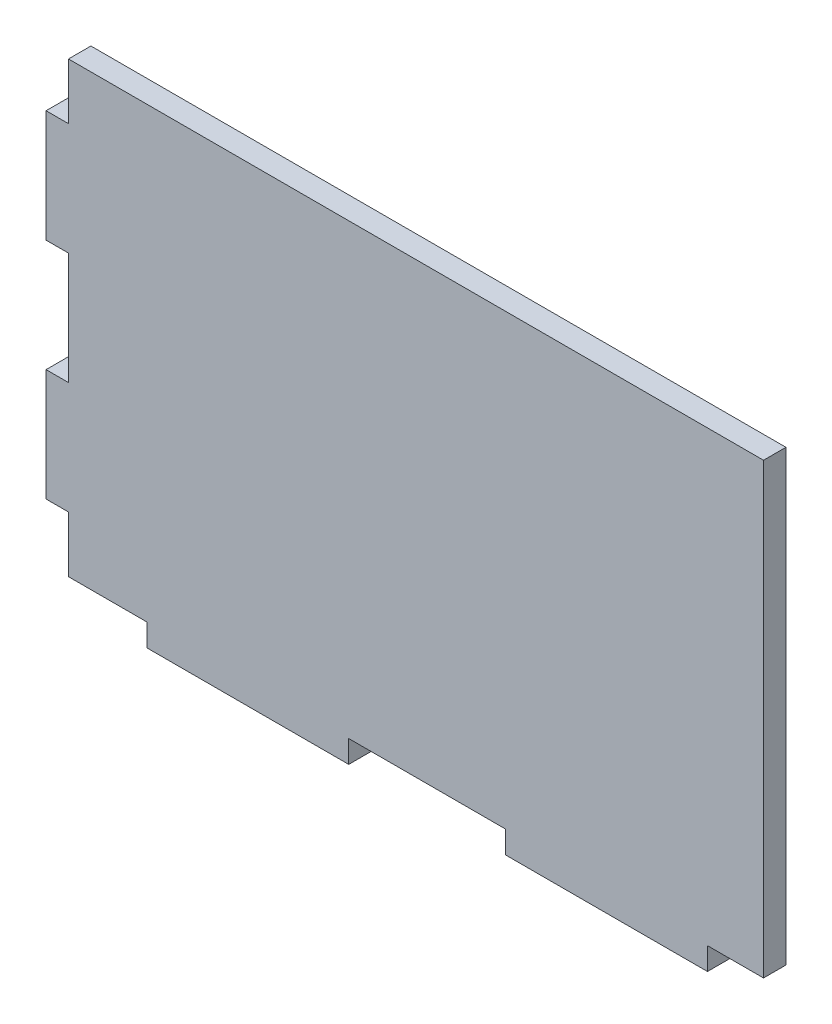
ISO-10303-21;
HEADER;
FILE_DESCRIPTION(('STEP AP214'),'2;1');
FILE_NAME('part.step','',(''),(''),'','','');
FILE_SCHEMA(('AUTOMOTIVE_DESIGN { 1 0 10303 214 1 1 1 1 }'));
ENDSEC;
DATA;
#1=APPLICATION_CONTEXT('core data for automotive mechanical design processes');
#2=APPLICATION_PROTOCOL_DEFINITION('international standard','automotive_design',2000,#1);
#3=PRODUCT_CONTEXT('',#1,'mechanical');
#4=PRODUCT('Part','Part','',(#3));
#5=PRODUCT_RELATED_PRODUCT_CATEGORY('part','',(#4));
#6=PRODUCT_DEFINITION_FORMATION('','',#4);
#7=PRODUCT_DEFINITION_CONTEXT('part definition',#1,'design');
#8=PRODUCT_DEFINITION('design','',#6,#7);
#9=PRODUCT_DEFINITION_SHAPE('','',#8);
#10=(LENGTH_UNIT() NAMED_UNIT(*) SI_UNIT(.MILLI.,.METRE.));
#11=(NAMED_UNIT(*) PLANE_ANGLE_UNIT() SI_UNIT($,.RADIAN.));
#12=(NAMED_UNIT(*) SI_UNIT($,.STERADIAN.) SOLID_ANGLE_UNIT());
#13=UNCERTAINTY_MEASURE_WITH_UNIT(LENGTH_MEASURE(1.E-05),#10,'distance_accuracy_value','');
#14=(GEOMETRIC_REPRESENTATION_CONTEXT(3) GLOBAL_UNCERTAINTY_ASSIGNED_CONTEXT((#13)) GLOBAL_UNIT_ASSIGNED_CONTEXT((#10,
#11,#12)) REPRESENTATION_CONTEXT('',''));
#15=CARTESIAN_POINT('',(0.,0.,0.));
#16=DIRECTION('',(0.,0.,1.));
#17=DIRECTION('',(1.,0.,0.));
#18=AXIS2_PLACEMENT_3D('',#15,#16,#17);
#19=CARTESIAN_POINT('',(0.,0.,5.));
#20=DIRECTION('',(-1.,0.,0.));
#21=DIRECTION('',(0.,0.,1.));
#22=AXIS2_PLACEMENT_3D('',#19,#20,#21);
#23=PLANE('',#22);
#24=DIRECTION('',(0.,1.,0.));
#25=VECTOR('',#24,1.);
#26=CARTESIAN_POINT('',(0.,0.,5.));
#27=LINE('',#26,#25);
#28=CARTESIAN_POINT('',(0.,37.5,5.));
#29=VERTEX_POINT('',#28);
#30=CARTESIAN_POINT('',(0.,62.5,5.));
#31=VERTEX_POINT('',#30);
#32=EDGE_CURVE('E241',#29,#31,#27,.T.);
#33=ORIENTED_EDGE('',*,*,#32,.T.);
#34=DIRECTION('',(0.,0.,1.));
#35=VECTOR('',#34,1.);
#36=CARTESIAN_POINT('',(0.,62.5,0.));
#37=LINE('',#36,#35);
#38=CARTESIAN_POINT('',(0.,62.5,0.));
#39=VERTEX_POINT('',#38);
#40=EDGE_CURVE('E205',#39,#31,#37,.T.);
#41=ORIENTED_EDGE('',*,*,#40,.F.);
#42=DIRECTION('',(0.,1.,0.));
#43=VECTOR('',#42,1.);
#44=CARTESIAN_POINT('',(0.,0.,0.));
#45=LINE('',#44,#43);
#46=CARTESIAN_POINT('',(0.,37.5,0.));
#47=VERTEX_POINT('',#46);
#48=EDGE_CURVE('E271',#47,#39,#45,.T.);
#49=ORIENTED_EDGE('',*,*,#48,.F.);
#50=DIRECTION('',(0.,0.,1.));
#51=VECTOR('',#50,1.);
#52=CARTESIAN_POINT('',(0.,37.5,0.));
#53=LINE('',#52,#51);
#54=EDGE_CURVE('E229',#47,#29,#53,.T.);
#55=ORIENTED_EDGE('',*,*,#54,.T.);
#56=EDGE_LOOP('',(#33,#41,#49,#55));
#57=FACE_BOUND('',#56,.T.);
#58=ADVANCED_FACE('F37',(#57),#23,.T.);
#59=DIRECTION('',(0.,0.,1.));
#60=VECTOR('',#59,1.);
#61=CARTESIAN_POINT('',(0.,87.5,0.));
#62=LINE('',#61,#60);
#63=CARTESIAN_POINT('',(0.,87.5,0.));
#64=VERTEX_POINT('',#63);
#65=CARTESIAN_POINT('',(0.,87.5,5.));
#66=VERTEX_POINT('',#65);
#67=EDGE_CURVE('E192',#64,#66,#62,.T.);
#68=ORIENTED_EDGE('',*,*,#67,.T.);
#69=CARTESIAN_POINT('',(0.,100.,5.));
#70=VERTEX_POINT('',#69);
#71=EDGE_CURVE('E235',#66,#70,#27,.T.);
#72=ORIENTED_EDGE('',*,*,#71,.T.);
#73=DIRECTION('',(0.,0.,-1.));
#74=VECTOR('',#73,1.);
#75=CARTESIAN_POINT('',(0.,100.,5.));
#76=LINE('',#75,#74);
#77=CARTESIAN_POINT('',(0.,100.,0.));
#78=VERTEX_POINT('',#77);
#79=EDGE_CURVE('E11',#70,#78,#76,.T.);
#80=ORIENTED_EDGE('',*,*,#79,.T.);
#81=EDGE_CURVE('E266',#64,#78,#45,.T.);
#82=ORIENTED_EDGE('',*,*,#81,.F.);
#83=EDGE_LOOP('',(#68,#72,#80,#82));
#84=FACE_BOUND('',#83,.T.);
#85=ADVANCED_FACE('F350',(#84),#23,.T.);
#86=CARTESIAN_POINT('',(0.,100.,5.));
#87=DIRECTION('',(0.,1.,0.));
#88=DIRECTION('',(0.,0.,1.));
#89=AXIS2_PLACEMENT_3D('',#86,#87,#88);
#90=PLANE('',#89);
#91=DIRECTION('',(1.,0.,0.));
#92=VECTOR('',#91,1.);
#93=CARTESIAN_POINT('',(0.,100.,0.));
#94=LINE('',#93,#92);
#95=CARTESIAN_POINT('',(155.,100.,0.));
#96=VERTEX_POINT('',#95);
#97=EDGE_CURVE('E226',#78,#96,#94,.T.);
#98=ORIENTED_EDGE('',*,*,#97,.F.);
#99=ORIENTED_EDGE('',*,*,#79,.F.);
#100=DIRECTION('',(1.,0.,0.));
#101=VECTOR('',#100,1.);
#102=CARTESIAN_POINT('',(0.,100.,5.));
#103=LINE('',#102,#101);
#104=CARTESIAN_POINT('',(155.,100.,5.));
#105=VERTEX_POINT('',#104);
#106=EDGE_CURVE('E232',#70,#105,#103,.T.);
#107=ORIENTED_EDGE('',*,*,#106,.T.);
#108=DIRECTION('',(0.,0.,-1.));
#109=VECTOR('',#108,1.);
#110=CARTESIAN_POINT('',(155.,100.,5.));
#111=LINE('',#110,#109);
#112=EDGE_CURVE('E264',#105,#96,#111,.T.);
#113=ORIENTED_EDGE('',*,*,#112,.T.);
#114=EDGE_LOOP('',(#98,#99,#107,#113));
#115=FACE_BOUND('',#114,.T.);
#116=ADVANCED_FACE('F39',(#115),#90,.T.);
#117=DIRECTION('',(0.,0.,1.));
#118=VECTOR('',#117,1.);
#119=CARTESIAN_POINT('',(0.,12.5,0.));
#120=LINE('',#119,#118);
#121=CARTESIAN_POINT('',(0.,12.5,0.));
#122=VERTEX_POINT('',#121);
#123=CARTESIAN_POINT('',(0.,12.5,5.));
#124=VERTEX_POINT('',#123);
#125=EDGE_CURVE('E217',#122,#124,#120,.T.);
#126=ORIENTED_EDGE('',*,*,#125,.F.);
#127=CARTESIAN_POINT('',(0.,0.,0.));
#128=VERTEX_POINT('',#127);
#129=EDGE_CURVE('E267',#128,#122,#45,.T.);
#130=ORIENTED_EDGE('',*,*,#129,.F.);
#131=DIRECTION('',(0.,0.,-1.));
#132=VECTOR('',#131,1.);
#133=CARTESIAN_POINT('',(0.,0.,5.));
#134=LINE('',#133,#132);
#135=CARTESIAN_POINT('',(0.,0.,5.));
#136=VERTEX_POINT('',#135);
#137=EDGE_CURVE('E45',#136,#128,#134,.T.);
#138=ORIENTED_EDGE('',*,*,#137,.F.);
#139=EDGE_CURVE('E237',#136,#124,#27,.T.);
#140=ORIENTED_EDGE('',*,*,#139,.T.);
#141=EDGE_LOOP('',(#126,#130,#138,#140));
#142=FACE_BOUND('',#141,.T.);
#143=ADVANCED_FACE('F329',(#142),#23,.T.);
#144=CARTESIAN_POINT('',(0.,0.,5.));
#145=DIRECTION('',(0.,1.,0.));
#146=DIRECTION('',(0.,0.,1.));
#147=AXIS2_PLACEMENT_3D('',#144,#145,#146);
#148=PLANE('',#147);
#149=DIRECTION('',(1.,0.,0.));
#150=VECTOR('',#149,1.);
#151=CARTESIAN_POINT('',(0.,0.,0.));
#152=LINE('',#151,#150);
#153=CARTESIAN_POINT('',(17.5,0.,0.));
#154=VERTEX_POINT('',#153);
#155=EDGE_CURVE('E270',#128,#154,#152,.T.);
#156=ORIENTED_EDGE('',*,*,#155,.T.);
#157=DIRECTION('',(0.,0.,-1.));
#158=VECTOR('',#157,1.);
#159=CARTESIAN_POINT('',(17.5,0.,5.));
#160=LINE('',#159,#158);
#161=CARTESIAN_POINT('',(17.5,0.,5.));
#162=VERTEX_POINT('',#161);
#163=EDGE_CURVE('E316',#162,#154,#160,.T.);
#164=ORIENTED_EDGE('',*,*,#163,.F.);
#165=DIRECTION('',(1.,0.,0.));
#166=VECTOR('',#165,1.);
#167=CARTESIAN_POINT('',(0.,0.,5.));
#168=LINE('',#167,#166);
#169=EDGE_CURVE('E240',#136,#162,#168,.T.);
#170=ORIENTED_EDGE('',*,*,#169,.F.);
#171=ORIENTED_EDGE('',*,*,#137,.T.);
#172=EDGE_LOOP('',(#156,#164,#170,#171));
#173=FACE_BOUND('',#172,.T.);
#174=ADVANCED_FACE('F321',(#173),#148,.F.);
#175=CARTESIAN_POINT('',(17.5,0.,5.));
#176=DIRECTION('',(1.,0.,0.));
#177=DIRECTION('',(0.,0.,-1.));
#178=AXIS2_PLACEMENT_3D('',#175,#176,#177);
#179=PLANE('',#178);
#180=DIRECTION('',(0.,-1.,0.));
#181=VECTOR('',#180,1.);
#182=CARTESIAN_POINT('',(17.5,0.,0.));
#183=LINE('',#182,#181);
#184=CARTESIAN_POINT('',(17.5,-5.,0.));
#185=VERTEX_POINT('',#184);
#186=EDGE_CURVE('E273',#154,#185,#183,.T.);
#187=ORIENTED_EDGE('',*,*,#186,.T.);
#188=DIRECTION('',(0.,0.,-1.));
#189=VECTOR('',#188,1.);
#190=CARTESIAN_POINT('',(17.5,-5.,5.));
#191=LINE('',#190,#189);
#192=CARTESIAN_POINT('',(17.5,-5.,5.));
#193=VERTEX_POINT('',#192);
#194=EDGE_CURVE('E313',#193,#185,#191,.T.);
#195=ORIENTED_EDGE('',*,*,#194,.F.);
#196=DIRECTION('',(0.,-1.,0.));
#197=VECTOR('',#196,1.);
#198=CARTESIAN_POINT('',(17.5,0.,5.));
#199=LINE('',#198,#197);
#200=EDGE_CURVE('E243',#162,#193,#199,.T.);
#201=ORIENTED_EDGE('',*,*,#200,.F.);
#202=ORIENTED_EDGE('',*,*,#163,.T.);
#203=EDGE_LOOP('',(#187,#195,#201,#202));
#204=FACE_BOUND('',#203,.T.);
#205=ADVANCED_FACE('F390',(#204),#179,.F.);
#206=CARTESIAN_POINT('',(0.,-5.,5.));
#207=DIRECTION('',(0.,1.,0.));
#208=DIRECTION('',(0.,0.,1.));
#209=AXIS2_PLACEMENT_3D('',#206,#207,#208);
#210=PLANE('',#209);
#211=DIRECTION('',(1.,0.,0.));
#212=VECTOR('',#211,1.);
#213=CARTESIAN_POINT('',(0.,-5.,0.));
#214=LINE('',#213,#212);
#215=CARTESIAN_POINT('',(62.5,-5.,0.));
#216=VERTEX_POINT('',#215);
#217=EDGE_CURVE('E275',#185,#216,#214,.T.);
#218=ORIENTED_EDGE('',*,*,#217,.T.);
#219=DIRECTION('',(0.,0.,-1.));
#220=VECTOR('',#219,1.);
#221=CARTESIAN_POINT('',(62.5,-5.,5.));
#222=LINE('',#221,#220);
#223=CARTESIAN_POINT('',(62.5,-5.,5.));
#224=VERTEX_POINT('',#223);
#225=EDGE_CURVE('E311',#224,#216,#222,.T.);
#226=ORIENTED_EDGE('',*,*,#225,.F.);
#227=DIRECTION('',(1.,0.,0.));
#228=VECTOR('',#227,1.);
#229=CARTESIAN_POINT('',(0.,-5.,5.));
#230=LINE('',#229,#228);
#231=EDGE_CURVE('E245',#193,#224,#230,.T.);
#232=ORIENTED_EDGE('',*,*,#231,.F.);
#233=ORIENTED_EDGE('',*,*,#194,.T.);
#234=EDGE_LOOP('',(#218,#226,#232,#233));
#235=FACE_BOUND('',#234,.T.);
#236=ADVANCED_FACE('F385',(#235),#210,.F.);
#237=CARTESIAN_POINT('',(62.5,0.,5.));
#238=DIRECTION('',(1.,0.,0.));
#239=DIRECTION('',(0.,0.,-1.));
#240=AXIS2_PLACEMENT_3D('',#237,#238,#239);
#241=PLANE('',#240);
#242=DIRECTION('',(0.,-1.,0.));
#243=VECTOR('',#242,1.);
#244=CARTESIAN_POINT('',(62.5,0.,0.));
#245=LINE('',#244,#243);
#246=CARTESIAN_POINT('',(62.5,0.,0.));
#247=VERTEX_POINT('',#246);
#248=EDGE_CURVE('E278',#247,#216,#245,.T.);
#249=ORIENTED_EDGE('',*,*,#248,.F.);
#250=DIRECTION('',(0.,0.,-1.));
#251=VECTOR('',#250,1.);
#252=CARTESIAN_POINT('',(62.5,0.,5.));
#253=LINE('',#252,#251);
#254=CARTESIAN_POINT('',(62.5,0.,5.));
#255=VERTEX_POINT('',#254);
#256=EDGE_CURVE('E309',#255,#247,#253,.T.);
#257=ORIENTED_EDGE('',*,*,#256,.F.);
#258=DIRECTION('',(0.,-1.,0.));
#259=VECTOR('',#258,1.);
#260=CARTESIAN_POINT('',(62.5,0.,5.));
#261=LINE('',#260,#259);
#262=EDGE_CURVE('E247',#255,#224,#261,.T.);
#263=ORIENTED_EDGE('',*,*,#262,.T.);
#264=ORIENTED_EDGE('',*,*,#225,.T.);
#265=EDGE_LOOP('',(#249,#257,#263,#264));
#266=FACE_BOUND('',#265,.T.);
#267=ADVANCED_FACE('F382',(#266),#241,.T.);
#268=CARTESIAN_POINT('',(0.,0.,5.));
#269=DIRECTION('',(0.,1.,0.));
#270=DIRECTION('',(0.,0.,1.));
#271=AXIS2_PLACEMENT_3D('',#268,#269,#270);
#272=PLANE('',#271);
#273=DIRECTION('',(1.,0.,0.));
#274=VECTOR('',#273,1.);
#275=CARTESIAN_POINT('',(0.,0.,0.));
#276=LINE('',#275,#274);
#277=CARTESIAN_POINT('',(97.5,0.,0.));
#278=VERTEX_POINT('',#277);
#279=EDGE_CURVE('E281',#247,#278,#276,.T.);
#280=ORIENTED_EDGE('',*,*,#279,.T.);
#281=DIRECTION('',(0.,0.,-1.));
#282=VECTOR('',#281,1.);
#283=CARTESIAN_POINT('',(97.5,0.,5.));
#284=LINE('',#283,#282);
#285=CARTESIAN_POINT('',(97.5,0.,5.));
#286=VERTEX_POINT('',#285);
#287=EDGE_CURVE('E306',#286,#278,#284,.T.);
#288=ORIENTED_EDGE('',*,*,#287,.F.);
#289=DIRECTION('',(1.,0.,0.));
#290=VECTOR('',#289,1.);
#291=CARTESIAN_POINT('',(0.,0.,5.));
#292=LINE('',#291,#290);
#293=EDGE_CURVE('E250',#255,#286,#292,.T.);
#294=ORIENTED_EDGE('',*,*,#293,.F.);
#295=ORIENTED_EDGE('',*,*,#256,.T.);
#296=EDGE_LOOP('',(#280,#288,#294,#295));
#297=FACE_BOUND('',#296,.T.);
#298=ADVANCED_FACE('F379',(#297),#272,.F.);
#299=CARTESIAN_POINT('',(97.5,0.,5.));
#300=DIRECTION('',(1.,0.,0.));
#301=DIRECTION('',(0.,0.,-1.));
#302=AXIS2_PLACEMENT_3D('',#299,#300,#301);
#303=PLANE('',#302);
#304=DIRECTION('',(0.,-1.,0.));
#305=VECTOR('',#304,1.);
#306=CARTESIAN_POINT('',(97.5,0.,0.));
#307=LINE('',#306,#305);
#308=CARTESIAN_POINT('',(97.5,-5.,0.));
#309=VERTEX_POINT('',#308);
#310=EDGE_CURVE('E283',#278,#309,#307,.T.);
#311=ORIENTED_EDGE('',*,*,#310,.T.);
#312=DIRECTION('',(0.,0.,-1.));
#313=VECTOR('',#312,1.);
#314=CARTESIAN_POINT('',(97.5,-5.,5.));
#315=LINE('',#314,#313);
#316=CARTESIAN_POINT('',(97.5,-5.,5.));
#317=VERTEX_POINT('',#316);
#318=EDGE_CURVE('E304',#317,#309,#315,.T.);
#319=ORIENTED_EDGE('',*,*,#318,.F.);
#320=DIRECTION('',(0.,-1.,0.));
#321=VECTOR('',#320,1.);
#322=CARTESIAN_POINT('',(97.5,0.,5.));
#323=LINE('',#322,#321);
#324=EDGE_CURVE('E252',#286,#317,#323,.T.);
#325=ORIENTED_EDGE('',*,*,#324,.F.);
#326=ORIENTED_EDGE('',*,*,#287,.T.);
#327=EDGE_LOOP('',(#311,#319,#325,#326));
#328=FACE_BOUND('',#327,.T.);
#329=ADVANCED_FACE('F374',(#328),#303,.F.);
#330=CARTESIAN_POINT('',(0.,-5.,5.));
#331=DIRECTION('',(0.,-1.,0.));
#332=DIRECTION('',(0.,0.,-1.));
#333=AXIS2_PLACEMENT_3D('',#330,#331,#332);
#334=PLANE('',#333);
#335=DIRECTION('',(-1.,0.,0.));
#336=VECTOR('',#335,1.);
#337=CARTESIAN_POINT('',(0.,-5.,0.));
#338=LINE('',#337,#336);
#339=CARTESIAN_POINT('',(142.5,-5.,0.));
#340=VERTEX_POINT('',#339);
#341=EDGE_CURVE('E286',#340,#309,#338,.T.);
#342=ORIENTED_EDGE('',*,*,#341,.F.);
#343=DIRECTION('',(0.,0.,-1.));
#344=VECTOR('',#343,1.);
#345=CARTESIAN_POINT('',(142.5,-5.,5.));
#346=LINE('',#345,#344);
#347=CARTESIAN_POINT('',(142.5,-5.,5.));
#348=VERTEX_POINT('',#347);
#349=EDGE_CURVE('E302',#348,#340,#346,.T.);
#350=ORIENTED_EDGE('',*,*,#349,.F.);
#351=DIRECTION('',(-1.,0.,0.));
#352=VECTOR('',#351,1.);
#353=CARTESIAN_POINT('',(0.,-5.,5.));
#354=LINE('',#353,#352);
#355=EDGE_CURVE('E254',#348,#317,#354,.T.);
#356=ORIENTED_EDGE('',*,*,#355,.T.);
#357=ORIENTED_EDGE('',*,*,#318,.T.);
#358=EDGE_LOOP('',(#342,#350,#356,#357));
#359=FACE_BOUND('',#358,.T.);
#360=ADVANCED_FACE('F368',(#359),#334,.T.);
#361=CARTESIAN_POINT('',(142.5,0.,5.));
#362=DIRECTION('',(1.,0.,0.));
#363=DIRECTION('',(0.,0.,-1.));
#364=AXIS2_PLACEMENT_3D('',#361,#362,#363);
#365=PLANE('',#364);
#366=DIRECTION('',(0.,-1.,0.));
#367=VECTOR('',#366,1.);
#368=CARTESIAN_POINT('',(142.5,0.,0.));
#369=LINE('',#368,#367);
#370=CARTESIAN_POINT('',(142.5,0.,0.));
#371=VERTEX_POINT('',#370);
#372=EDGE_CURVE('E289',#371,#340,#369,.T.);
#373=ORIENTED_EDGE('',*,*,#372,.F.);
#374=DIRECTION('',(0.,0.,-1.));
#375=VECTOR('',#374,1.);
#376=CARTESIAN_POINT('',(142.5,0.,5.));
#377=LINE('',#376,#375);
#378=CARTESIAN_POINT('',(142.5,0.,5.));
#379=VERTEX_POINT('',#378);
#380=EDGE_CURVE('E300',#379,#371,#377,.T.);
#381=ORIENTED_EDGE('',*,*,#380,.F.);
#382=DIRECTION('',(0.,-1.,0.));
#383=VECTOR('',#382,1.);
#384=CARTESIAN_POINT('',(142.5,0.,5.));
#385=LINE('',#384,#383);
#386=EDGE_CURVE('E257',#379,#348,#385,.T.);
#387=ORIENTED_EDGE('',*,*,#386,.T.);
#388=ORIENTED_EDGE('',*,*,#349,.T.);
#389=EDGE_LOOP('',(#373,#381,#387,#388));
#390=FACE_BOUND('',#389,.T.);
#391=ADVANCED_FACE('F362',(#390),#365,.T.);
#392=CARTESIAN_POINT('',(0.,0.,5.));
#393=DIRECTION('',(0.,1.,0.));
#394=DIRECTION('',(-1.,0.,0.));
#395=AXIS2_PLACEMENT_3D('',#392,#393,#394);
#396=PLANE('',#395);
#397=DIRECTION('',(1.,0.,0.));
#398=VECTOR('',#397,1.);
#399=CARTESIAN_POINT('',(0.,0.,0.));
#400=LINE('',#399,#398);
#401=CARTESIAN_POINT('',(155.,0.,0.));
#402=VERTEX_POINT('',#401);
#403=EDGE_CURVE('E292',#371,#402,#400,.T.);
#404=ORIENTED_EDGE('',*,*,#403,.T.);
#405=DIRECTION('',(0.,0.,-1.));
#406=VECTOR('',#405,1.);
#407=CARTESIAN_POINT('',(155.,0.,5.));
#408=LINE('',#407,#406);
#409=CARTESIAN_POINT('',(155.,0.,5.));
#410=VERTEX_POINT('',#409);
#411=EDGE_CURVE('E297',#410,#402,#408,.T.);
#412=ORIENTED_EDGE('',*,*,#411,.F.);
#413=DIRECTION('',(1.,0.,0.));
#414=VECTOR('',#413,1.);
#415=CARTESIAN_POINT('',(0.,0.,5.));
#416=LINE('',#415,#414);
#417=EDGE_CURVE('E260',#379,#410,#416,.T.);
#418=ORIENTED_EDGE('',*,*,#417,.F.);
#419=ORIENTED_EDGE('',*,*,#380,.T.);
#420=EDGE_LOOP('',(#404,#412,#418,#419));
#421=FACE_BOUND('',#420,.T.);
#422=ADVANCED_FACE('F391',(#421),#396,.F.);
#423=CARTESIAN_POINT('',(155.,0.,5.));
#424=DIRECTION('',(-1.,0.,0.));
#425=DIRECTION('',(0.,0.,1.));
#426=AXIS2_PLACEMENT_3D('',#423,#424,#425);
#427=PLANE('',#426);
#428=DIRECTION('',(0.,1.,0.));
#429=VECTOR('',#428,1.);
#430=CARTESIAN_POINT('',(155.,0.,0.));
#431=LINE('',#430,#429);
#432=EDGE_CURVE('E236',#402,#96,#431,.T.);
#433=ORIENTED_EDGE('',*,*,#432,.T.);
#434=ORIENTED_EDGE('',*,*,#112,.F.);
#435=DIRECTION('',(0.,1.,0.));
#436=VECTOR('',#435,1.);
#437=CARTESIAN_POINT('',(155.,0.,5.));
#438=LINE('',#437,#436);
#439=EDGE_CURVE('E262',#410,#105,#438,.T.);
#440=ORIENTED_EDGE('',*,*,#439,.F.);
#441=ORIENTED_EDGE('',*,*,#411,.T.);
#442=EDGE_LOOP('',(#433,#434,#440,#441));
#443=FACE_BOUND('',#442,.T.);
#444=ADVANCED_FACE('F356',(#443),#427,.F.);
#445=CARTESIAN_POINT('',(0.,0.,5.));
#446=DIRECTION('',(0.,0.,1.));
#447=DIRECTION('',(1.,0.,0.));
#448=AXIS2_PLACEMENT_3D('',#445,#446,#447);
#449=PLANE('',#448);
#450=ORIENTED_EDGE('',*,*,#106,.F.);
#451=ORIENTED_EDGE('',*,*,#71,.F.);
#452=DIRECTION('',(-1.,0.,0.));
#453=VECTOR('',#452,1.);
#454=CARTESIAN_POINT('',(0.,87.5,5.));
#455=LINE('',#454,#453);
#456=CARTESIAN_POINT('',(-5.,87.5,5.));
#457=VERTEX_POINT('',#456);
#458=EDGE_CURVE('E200',#66,#457,#455,.T.);
#459=ORIENTED_EDGE('',*,*,#458,.T.);
#460=DIRECTION('',(0.,-1.,0.));
#461=VECTOR('',#460,1.);
#462=CARTESIAN_POINT('',(-4.99999999999999,0.,5.));
#463=LINE('',#462,#461);
#464=CARTESIAN_POINT('',(-5.,62.5,5.));
#465=VERTEX_POINT('',#464);
#466=EDGE_CURVE('E179',#457,#465,#463,.T.);
#467=ORIENTED_EDGE('',*,*,#466,.T.);
#468=DIRECTION('',(-1.,0.,0.));
#469=VECTOR('',#468,1.);
#470=CARTESIAN_POINT('',(0.,62.5,5.));
#471=LINE('',#470,#469);
#472=EDGE_CURVE('E194',#31,#465,#471,.T.);
#473=ORIENTED_EDGE('',*,*,#472,.F.);
#474=ORIENTED_EDGE('',*,*,#32,.F.);
#475=DIRECTION('',(-1.,0.,0.));
#476=VECTOR('',#475,1.);
#477=CARTESIAN_POINT('',(0.,37.5,5.));
#478=LINE('',#477,#476);
#479=CARTESIAN_POINT('',(-5.,37.5,5.));
#480=VERTEX_POINT('',#479);
#481=EDGE_CURVE('E60',#29,#480,#478,.T.);
#482=ORIENTED_EDGE('',*,*,#481,.T.);
#483=DIRECTION('',(0.,1.,0.));
#484=VECTOR('',#483,1.);
#485=CARTESIAN_POINT('',(-5.,0.,5.));
#486=LINE('',#485,#484);
#487=CARTESIAN_POINT('',(-5.,12.5,5.));
#488=VERTEX_POINT('',#487);
#489=EDGE_CURVE('E212',#488,#480,#486,.T.);
#490=ORIENTED_EDGE('',*,*,#489,.F.);
#491=DIRECTION('',(-1.,0.,0.));
#492=VECTOR('',#491,1.);
#493=CARTESIAN_POINT('',(0.,12.5,5.));
#494=LINE('',#493,#492);
#495=EDGE_CURVE('E204',#124,#488,#494,.T.);
#496=ORIENTED_EDGE('',*,*,#495,.F.);
#497=ORIENTED_EDGE('',*,*,#139,.F.);
#498=ORIENTED_EDGE('',*,*,#169,.T.);
#499=ORIENTED_EDGE('',*,*,#200,.T.);
#500=ORIENTED_EDGE('',*,*,#231,.T.);
#501=ORIENTED_EDGE('',*,*,#262,.F.);
#502=ORIENTED_EDGE('',*,*,#293,.T.);
#503=ORIENTED_EDGE('',*,*,#324,.T.);
#504=ORIENTED_EDGE('',*,*,#355,.F.);
#505=ORIENTED_EDGE('',*,*,#386,.F.);
#506=ORIENTED_EDGE('',*,*,#417,.T.);
#507=ORIENTED_EDGE('',*,*,#439,.T.);
#508=EDGE_LOOP('',(#450,#451,#459,#467,#473,#474,#482,#490,#496,#497,#498,#499,#500,#501,#502,
#503,#504,#505,#506,#507));
#509=FACE_BOUND('',#508,.T.);
#510=ADVANCED_FACE('F336',(#509),#449,.T.);
#511=CARTESIAN_POINT('',(0.,0.,0.));
#512=DIRECTION('',(0.,0.,1.));
#513=DIRECTION('',(1.,0.,0.));
#514=AXIS2_PLACEMENT_3D('',#511,#512,#513);
#515=PLANE('',#514);
#516=ORIENTED_EDGE('',*,*,#97,.T.);
#517=ORIENTED_EDGE('',*,*,#432,.F.);
#518=ORIENTED_EDGE('',*,*,#403,.F.);
#519=ORIENTED_EDGE('',*,*,#372,.T.);
#520=ORIENTED_EDGE('',*,*,#341,.T.);
#521=ORIENTED_EDGE('',*,*,#310,.F.);
#522=ORIENTED_EDGE('',*,*,#279,.F.);
#523=ORIENTED_EDGE('',*,*,#248,.T.);
#524=ORIENTED_EDGE('',*,*,#217,.F.);
#525=ORIENTED_EDGE('',*,*,#186,.F.);
#526=ORIENTED_EDGE('',*,*,#155,.F.);
#527=ORIENTED_EDGE('',*,*,#129,.T.);
#528=DIRECTION('',(-1.,0.,0.));
#529=VECTOR('',#528,1.);
#530=CARTESIAN_POINT('',(0.,12.5,0.));
#531=LINE('',#530,#529);
#532=CARTESIAN_POINT('',(-5.,12.5,0.));
#533=VERTEX_POINT('',#532);
#534=EDGE_CURVE('E208',#122,#533,#531,.T.);
#535=ORIENTED_EDGE('',*,*,#534,.T.);
#536=DIRECTION('',(0.,1.,0.));
#537=VECTOR('',#536,1.);
#538=CARTESIAN_POINT('',(-5.,0.,0.));
#539=LINE('',#538,#537);
#540=CARTESIAN_POINT('',(-5.,37.5,0.));
#541=VERTEX_POINT('',#540);
#542=EDGE_CURVE('E215',#533,#541,#539,.T.);
#543=ORIENTED_EDGE('',*,*,#542,.T.);
#544=DIRECTION('',(-1.,0.,0.));
#545=VECTOR('',#544,1.);
#546=CARTESIAN_POINT('',(0.,37.5,0.));
#547=LINE('',#546,#545);
#548=EDGE_CURVE('E211',#47,#541,#547,.T.);
#549=ORIENTED_EDGE('',*,*,#548,.F.);
#550=ORIENTED_EDGE('',*,*,#48,.T.);
#551=DIRECTION('',(-1.,0.,0.));
#552=VECTOR('',#551,1.);
#553=CARTESIAN_POINT('',(0.,62.5,0.));
#554=LINE('',#553,#552);
#555=CARTESIAN_POINT('',(-5.,62.5,0.));
#556=VERTEX_POINT('',#555);
#557=EDGE_CURVE('E183',#39,#556,#554,.T.);
#558=ORIENTED_EDGE('',*,*,#557,.T.);
#559=DIRECTION('',(0.,-1.,0.));
#560=VECTOR('',#559,1.);
#561=CARTESIAN_POINT('',(-4.99999999999999,0.,0.));
#562=LINE('',#561,#560);
#563=CARTESIAN_POINT('',(-5.,87.5,0.));
#564=VERTEX_POINT('',#563);
#565=EDGE_CURVE('E177',#564,#556,#562,.T.);
#566=ORIENTED_EDGE('',*,*,#565,.F.);
#567=DIRECTION('',(-1.,0.,0.));
#568=VECTOR('',#567,1.);
#569=CARTESIAN_POINT('',(0.,87.5,0.));
#570=LINE('',#569,#568);
#571=EDGE_CURVE('E52',#64,#564,#570,.T.);
#572=ORIENTED_EDGE('',*,*,#571,.F.);
#573=ORIENTED_EDGE('',*,*,#81,.T.);
#574=EDGE_LOOP('',(#516,#517,#518,#519,#520,#521,#522,#523,#524,#525,#526,#527,#535,#543,#549,
#550,#558,#566,#572,#573));
#575=FACE_BOUND('',#574,.T.);
#576=ADVANCED_FACE('F186',(#575),#515,.F.);
#577=CARTESIAN_POINT('',(0.,12.5,0.));
#578=DIRECTION('',(0.,1.,0.));
#579=DIRECTION('',(0.,0.,1.));
#580=AXIS2_PLACEMENT_3D('',#577,#578,#579);
#581=PLANE('',#580);
#582=ORIENTED_EDGE('',*,*,#495,.T.);
#583=DIRECTION('',(0.,0.,1.));
#584=VECTOR('',#583,1.);
#585=CARTESIAN_POINT('',(-5.,12.5,0.));
#586=LINE('',#585,#584);
#587=EDGE_CURVE('E223',#533,#488,#586,.T.);
#588=ORIENTED_EDGE('',*,*,#587,.F.);
#589=ORIENTED_EDGE('',*,*,#534,.F.);
#590=ORIENTED_EDGE('',*,*,#125,.T.);
#591=EDGE_LOOP('',(#582,#588,#589,#590));
#592=FACE_BOUND('',#591,.T.);
#593=ADVANCED_FACE('F332',(#592),#581,.F.);
#594=CARTESIAN_POINT('',(-5.,0.,0.));
#595=DIRECTION('',(1.,0.,0.));
#596=DIRECTION('',(0.,1.,0.));
#597=AXIS2_PLACEMENT_3D('',#594,#595,#596);
#598=PLANE('',#597);
#599=ORIENTED_EDGE('',*,*,#489,.T.);
#600=DIRECTION('',(0.,0.,1.));
#601=VECTOR('',#600,1.);
#602=CARTESIAN_POINT('',(-5.,37.5,0.));
#603=LINE('',#602,#601);
#604=EDGE_CURVE('E227',#541,#480,#603,.T.);
#605=ORIENTED_EDGE('',*,*,#604,.F.);
#606=ORIENTED_EDGE('',*,*,#542,.F.);
#607=ORIENTED_EDGE('',*,*,#587,.T.);
#608=EDGE_LOOP('',(#599,#605,#606,#607));
#609=FACE_BOUND('',#608,.T.);
#610=ADVANCED_FACE('F340',(#609),#598,.F.);
#611=CARTESIAN_POINT('',(0.,37.5,0.));
#612=DIRECTION('',(0.,1.,0.));
#613=DIRECTION('',(-1.,0.,0.));
#614=AXIS2_PLACEMENT_3D('',#611,#612,#613);
#615=PLANE('',#614);
#616=ORIENTED_EDGE('',*,*,#481,.F.);
#617=ORIENTED_EDGE('',*,*,#54,.F.);
#618=ORIENTED_EDGE('',*,*,#548,.T.);
#619=ORIENTED_EDGE('',*,*,#604,.T.);
#620=EDGE_LOOP('',(#616,#617,#618,#619));
#621=FACE_BOUND('',#620,.T.);
#622=ADVANCED_FACE('F463',(#621),#615,.T.);
#623=CARTESIAN_POINT('',(0.,87.5,0.));
#624=DIRECTION('',(0.,1.,0.));
#625=DIRECTION('',(0.,0.,1.));
#626=AXIS2_PLACEMENT_3D('',#623,#624,#625);
#627=PLANE('',#626);
#628=ORIENTED_EDGE('',*,*,#458,.F.);
#629=ORIENTED_EDGE('',*,*,#67,.F.);
#630=ORIENTED_EDGE('',*,*,#571,.T.);
#631=DIRECTION('',(0.,0.,1.));
#632=VECTOR('',#631,1.);
#633=CARTESIAN_POINT('',(-5.,87.5,0.));
#634=LINE('',#633,#632);
#635=EDGE_CURVE('E175',#564,#457,#634,.T.);
#636=ORIENTED_EDGE('',*,*,#635,.T.);
#637=EDGE_LOOP('',(#628,#629,#630,#636));
#638=FACE_BOUND('',#637,.T.);
#639=ADVANCED_FACE('F190',(#638),#627,.T.);
#640=CARTESIAN_POINT('',(0.,62.5,0.));
#641=DIRECTION('',(0.,1.,0.));
#642=DIRECTION('',(0.,0.,1.));
#643=AXIS2_PLACEMENT_3D('',#640,#641,#642);
#644=PLANE('',#643);
#645=ORIENTED_EDGE('',*,*,#472,.T.);
#646=DIRECTION('',(0.,0.,1.));
#647=VECTOR('',#646,1.);
#648=CARTESIAN_POINT('',(-5.,62.5,0.));
#649=LINE('',#648,#647);
#650=EDGE_CURVE('E182',#556,#465,#649,.T.);
#651=ORIENTED_EDGE('',*,*,#650,.F.);
#652=ORIENTED_EDGE('',*,*,#557,.F.);
#653=ORIENTED_EDGE('',*,*,#40,.T.);
#654=EDGE_LOOP('',(#645,#651,#652,#653));
#655=FACE_BOUND('',#654,.T.);
#656=ADVANCED_FACE('F480',(#655),#644,.F.);
#657=CARTESIAN_POINT('',(-4.99999999999999,0.,0.));
#658=DIRECTION('',(-1.,0.,0.));
#659=DIRECTION('',(0.,-1.,0.));
#660=AXIS2_PLACEMENT_3D('',#657,#658,#659);
#661=PLANE('',#660);
#662=ORIENTED_EDGE('',*,*,#466,.F.);
#663=ORIENTED_EDGE('',*,*,#635,.F.);
#664=ORIENTED_EDGE('',*,*,#565,.T.);
#665=ORIENTED_EDGE('',*,*,#650,.T.);
#666=EDGE_LOOP('',(#662,#663,#664,#665));
#667=FACE_BOUND('',#666,.T.);
#668=ADVANCED_FACE('F176',(#667),#661,.T.);
#669=CLOSED_SHELL('',(#58,#85,#116,#143,#174,#205,#236,#267,#298,#329,#360,#391,#422,#444,#510,
#576,#593,#610,#622,#639,#656,#668));
#670=MANIFOLD_SOLID_BREP('B2',#669);
#671=ADVANCED_BREP_SHAPE_REPRESENTATION('',(#18,#670),#14);
#672=SHAPE_DEFINITION_REPRESENTATION(#9,#671);
ENDSEC;
END-ISO-10303-21;
